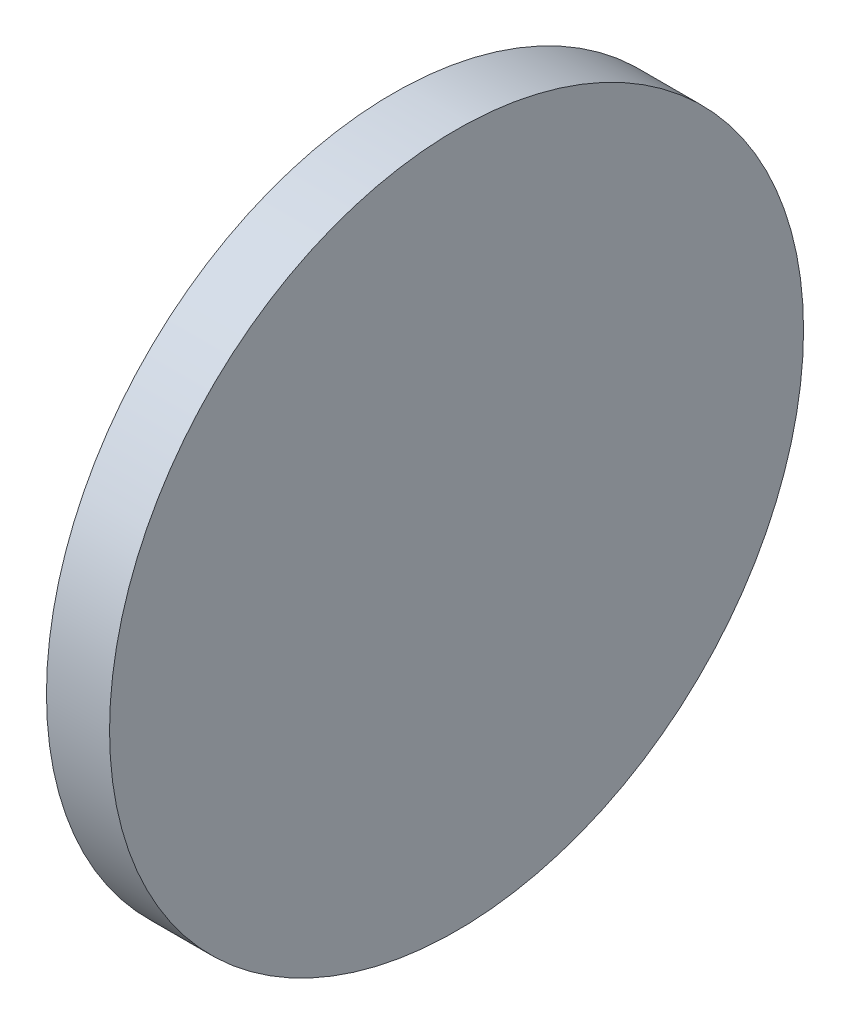
ISO-10303-21;
HEADER;
FILE_DESCRIPTION(('STEP AP214'),'2;1');
FILE_NAME('part.step','',(''),(''),'','','');
FILE_SCHEMA(('AUTOMOTIVE_DESIGN { 1 0 10303 214 1 1 1 1 }'));
ENDSEC;
DATA;
#1=APPLICATION_CONTEXT('core data for automotive mechanical design processes');
#2=APPLICATION_PROTOCOL_DEFINITION('international standard','automotive_design',2000,#1);
#3=PRODUCT_CONTEXT('',#1,'mechanical');
#4=PRODUCT('Part','Part','',(#3));
#5=PRODUCT_RELATED_PRODUCT_CATEGORY('part','',(#4));
#6=PRODUCT_DEFINITION_FORMATION('','',#4);
#7=PRODUCT_DEFINITION_CONTEXT('part definition',#1,'design');
#8=PRODUCT_DEFINITION('design','',#6,#7);
#9=PRODUCT_DEFINITION_SHAPE('','',#8);
#10=(LENGTH_UNIT() NAMED_UNIT(*) SI_UNIT(.MILLI.,.METRE.));
#11=(NAMED_UNIT(*) PLANE_ANGLE_UNIT() SI_UNIT($,.RADIAN.));
#12=(NAMED_UNIT(*) SI_UNIT($,.STERADIAN.) SOLID_ANGLE_UNIT());
#13=UNCERTAINTY_MEASURE_WITH_UNIT(LENGTH_MEASURE(1.E-05),#10,'distance_accuracy_value','');
#14=(GEOMETRIC_REPRESENTATION_CONTEXT(3) GLOBAL_UNCERTAINTY_ASSIGNED_CONTEXT((#13)) GLOBAL_UNIT_ASSIGNED_CONTEXT((#10,
#11,#12)) REPRESENTATION_CONTEXT('',''));
#15=CARTESIAN_POINT('',(0.,0.,0.));
#16=DIRECTION('',(0.,0.,1.));
#17=DIRECTION('',(1.,0.,0.));
#18=AXIS2_PLACEMENT_3D('',#15,#16,#17);
#19=CARTESIAN_POINT('',(2.,0.,0.));
#20=DIRECTION('',(-1.,0.,0.));
#21=DIRECTION('',(0.,0.,1.));
#22=AXIS2_PLACEMENT_3D('',#19,#20,#21);
#23=CYLINDRICAL_SURFACE('',#22,11.);
#24=CARTESIAN_POINT('',(2.,0.,0.));
#25=DIRECTION('',(1.,0.,0.));
#26=DIRECTION('',(0.,0.,-1.));
#27=AXIS2_PLACEMENT_3D('',#24,#25,#26);
#28=CIRCLE('',#27,11.);
#29=CARTESIAN_POINT('',(2.,0.,-11.));
#30=VERTEX_POINT('',#29);
#31=EDGE_CURVE('E10',#30,#30,#28,.T.);
#32=ORIENTED_EDGE('',*,*,#31,.F.);
#33=EDGE_LOOP('',(#32));
#34=FACE_BOUND('',#33,.T.);
#35=CARTESIAN_POINT('',(0.,0.,0.));
#36=DIRECTION('',(1.,0.,0.));
#37=DIRECTION('',(0.,0.,-1.));
#38=AXIS2_PLACEMENT_3D('',#35,#36,#37);
#39=CIRCLE('',#38,11.);
#40=CARTESIAN_POINT('',(0.,0.,-11.));
#41=VERTEX_POINT('',#40);
#42=EDGE_CURVE('E37',#41,#41,#39,.T.);
#43=ORIENTED_EDGE('',*,*,#42,.T.);
#44=EDGE_LOOP('',(#43));
#45=FACE_BOUND('',#44,.T.);
#46=ADVANCED_FACE('F40',(#34,#45),#23,.T.);
#47=CARTESIAN_POINT('',(2.,0.,0.));
#48=DIRECTION('',(1.,0.,0.));
#49=DIRECTION('',(0.,0.,-1.));
#50=AXIS2_PLACEMENT_3D('',#47,#48,#49);
#51=PLANE('',#50);
#52=ORIENTED_EDGE('',*,*,#31,.T.);
#53=EDGE_LOOP('',(#52));
#54=FACE_BOUND('',#53,.T.);
#55=ADVANCED_FACE('F55',(#54),#51,.T.);
#56=CARTESIAN_POINT('',(0.,0.,0.));
#57=DIRECTION('',(1.,0.,0.));
#58=DIRECTION('',(0.,0.,-1.));
#59=AXIS2_PLACEMENT_3D('',#56,#57,#58);
#60=PLANE('',#59);
#61=ORIENTED_EDGE('',*,*,#42,.F.);
#62=EDGE_LOOP('',(#61));
#63=FACE_BOUND('',#62,.T.);
#64=ADVANCED_FACE('F49',(#63),#60,.F.);
#65=CLOSED_SHELL('',(#46,#55,#64));
#66=MANIFOLD_SOLID_BREP('B2',#65);
#67=ADVANCED_BREP_SHAPE_REPRESENTATION('',(#18,#66),#14);
#68=SHAPE_DEFINITION_REPRESENTATION(#9,#67);
ENDSEC;
END-ISO-10303-21;
